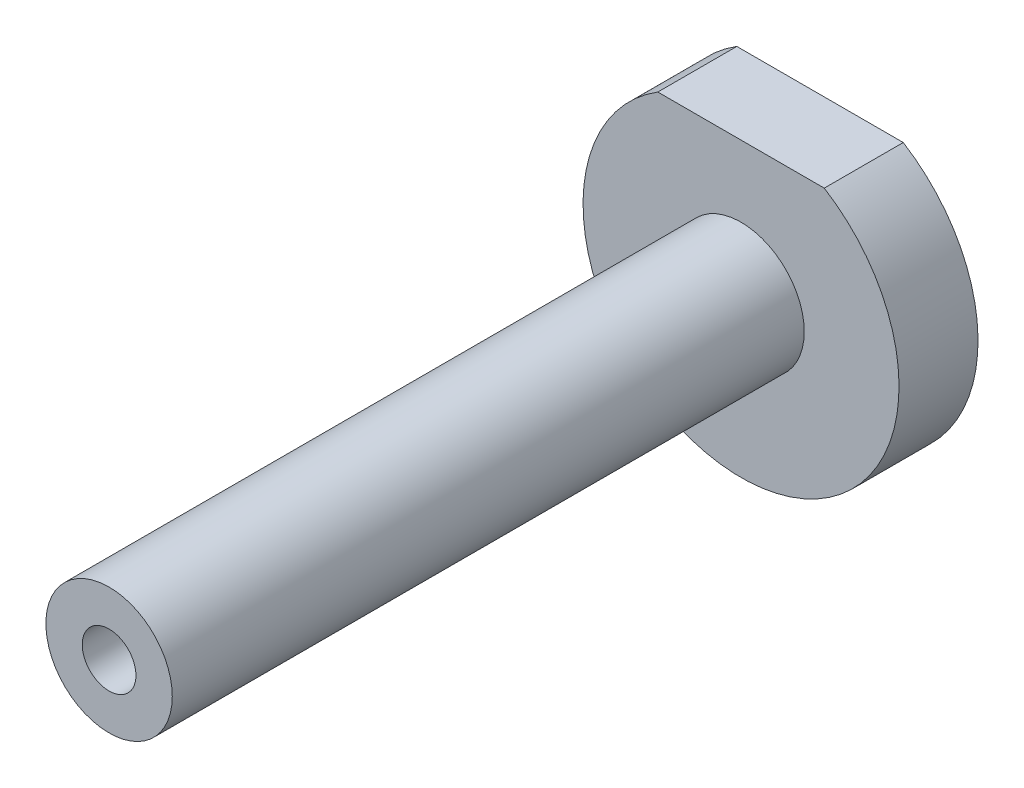
ISO-10303-21;
HEADER;
FILE_DESCRIPTION(('STEP AP214'),'2;1');
FILE_NAME('part.step','',(''),(''),'','','');
FILE_SCHEMA(('AUTOMOTIVE_DESIGN { 1 0 10303 214 1 1 1 1 }'));
ENDSEC;
DATA;
#1=APPLICATION_CONTEXT('core data for automotive mechanical design processes');
#2=APPLICATION_PROTOCOL_DEFINITION('international standard','automotive_design',2000,#1);
#3=PRODUCT_CONTEXT('',#1,'mechanical');
#4=PRODUCT('Part','Part','',(#3));
#5=PRODUCT_RELATED_PRODUCT_CATEGORY('part','',(#4));
#6=PRODUCT_DEFINITION_FORMATION('','',#4);
#7=PRODUCT_DEFINITION_CONTEXT('part definition',#1,'design');
#8=PRODUCT_DEFINITION('design','',#6,#7);
#9=PRODUCT_DEFINITION_SHAPE('','',#8);
#10=(LENGTH_UNIT() NAMED_UNIT(*) SI_UNIT(.MILLI.,.METRE.));
#11=(NAMED_UNIT(*) PLANE_ANGLE_UNIT() SI_UNIT($,.RADIAN.));
#12=(NAMED_UNIT(*) SI_UNIT($,.STERADIAN.) SOLID_ANGLE_UNIT());
#13=UNCERTAINTY_MEASURE_WITH_UNIT(LENGTH_MEASURE(1.E-05),#10,'distance_accuracy_value','');
#14=(GEOMETRIC_REPRESENTATION_CONTEXT(3) GLOBAL_UNCERTAINTY_ASSIGNED_CONTEXT((#13)) GLOBAL_UNIT_ASSIGNED_CONTEXT((#10,
#11,#12)) REPRESENTATION_CONTEXT('',''));
#15=CARTESIAN_POINT('',(0.,0.,0.));
#16=DIRECTION('',(0.,0.,1.));
#17=DIRECTION('',(1.,0.,0.));
#18=AXIS2_PLACEMENT_3D('',#15,#16,#17);
#19=CARTESIAN_POINT('',(0.,0.,10.));
#20=DIRECTION('',(0.,0.,-1.));
#21=DIRECTION('',(-1.,0.,0.));
#22=AXIS2_PLACEMENT_3D('',#19,#20,#21);
#23=CYLINDRICAL_SURFACE('',#22,20.);
#24=DIRECTION('',(0.,0.,-1.));
#25=VECTOR('',#24,1.);
#26=CARTESIAN_POINT('',(10.5356537528527,17.,10.));
#27=LINE('',#26,#25);
#28=CARTESIAN_POINT('',(10.5356537528527,17.,10.));
#29=VERTEX_POINT('',#28);
#30=CARTESIAN_POINT('',(10.5356537528527,17.,0.));
#31=VERTEX_POINT('',#30);
#32=EDGE_CURVE('E59',#29,#31,#27,.T.);
#33=ORIENTED_EDGE('',*,*,#32,.F.);
#34=CARTESIAN_POINT('',(0.,0.,10.));
#35=DIRECTION('',(0.,0.,1.));
#36=DIRECTION('',(1.,0.,0.));
#37=AXIS2_PLACEMENT_3D('',#34,#35,#36);
#38=CIRCLE('',#37,20.);
#39=CARTESIAN_POINT('',(-10.5356537528527,17.,10.));
#40=VERTEX_POINT('',#39);
#41=EDGE_CURVE('E106',#40,#29,#38,.T.);
#42=ORIENTED_EDGE('',*,*,#41,.F.);
#43=DIRECTION('',(0.,0.,-1.));
#44=VECTOR('',#43,1.);
#45=CARTESIAN_POINT('',(-10.5356537528527,17.,10.));
#46=LINE('',#45,#44);
#47=CARTESIAN_POINT('',(-10.5356537528527,17.,0.));
#48=VERTEX_POINT('',#47);
#49=EDGE_CURVE('E64',#48,#40,#46,.F.);
#50=ORIENTED_EDGE('',*,*,#49,.F.);
#51=CARTESIAN_POINT('',(0.,0.,0.));
#52=DIRECTION('',(0.,0.,1.));
#53=DIRECTION('',(1.,0.,0.));
#54=AXIS2_PLACEMENT_3D('',#51,#52,#53);
#55=CIRCLE('',#54,20.);
#56=EDGE_CURVE('E102',#48,#31,#55,.T.);
#57=ORIENTED_EDGE('',*,*,#56,.T.);
#58=EDGE_LOOP('',(#33,#42,#50,#57));
#59=FACE_BOUND('',#58,.T.);
#60=ADVANCED_FACE('F45',(#59),#23,.T.);
#61=CARTESIAN_POINT('',(0.,0.,10.));
#62=DIRECTION('',(0.,0.,1.));
#63=DIRECTION('',(1.,0.,0.));
#64=AXIS2_PLACEMENT_3D('',#61,#62,#63);
#65=PLANE('',#64);
#66=CARTESIAN_POINT('',(0.,0.,10.));
#67=DIRECTION('',(0.,0.,1.));
#68=DIRECTION('',(1.,0.,0.));
#69=AXIS2_PLACEMENT_3D('',#66,#67,#68);
#70=CIRCLE('',#69,8.);
#71=CARTESIAN_POINT('',(8.,0.,10.));
#72=VERTEX_POINT('',#71);
#73=EDGE_CURVE('E53',#72,#72,#70,.T.);
#74=ORIENTED_EDGE('',*,*,#73,.F.);
#75=EDGE_LOOP('',(#74));
#76=FACE_BOUND('',#75,.T.);
#77=ORIENTED_EDGE('',*,*,#41,.T.);
#78=DIRECTION('',(-1.,0.,0.));
#79=VECTOR('',#78,1.);
#80=CARTESIAN_POINT('',(0.,17.,10.));
#81=LINE('',#80,#79);
#82=EDGE_CURVE('E84',#29,#40,#81,.T.);
#83=ORIENTED_EDGE('',*,*,#82,.T.);
#84=EDGE_LOOP('',(#77,#83));
#85=FACE_BOUND('',#84,.T.);
#86=ADVANCED_FACE('F127',(#76,#85),#65,.T.);
#87=CARTESIAN_POINT('',(0.,0.,0.));
#88=DIRECTION('',(0.,0.,1.));
#89=DIRECTION('',(1.,0.,0.));
#90=AXIS2_PLACEMENT_3D('',#87,#88,#89);
#91=PLANE('',#90);
#92=DIRECTION('',(-1.,0.,0.));
#93=VECTOR('',#92,1.);
#94=CARTESIAN_POINT('',(0.,17.,0.));
#95=LINE('',#94,#93);
#96=EDGE_CURVE('E11',#31,#48,#95,.T.);
#97=ORIENTED_EDGE('',*,*,#96,.F.);
#98=ORIENTED_EDGE('',*,*,#56,.F.);
#99=EDGE_LOOP('',(#97,#98));
#100=FACE_BOUND('',#99,.T.);
#101=ADVANCED_FACE('F116',(#100),#91,.F.);
#102=CARTESIAN_POINT('',(0.,0.,90.));
#103=DIRECTION('',(0.,0.,-1.));
#104=DIRECTION('',(-1.,0.,0.));
#105=AXIS2_PLACEMENT_3D('',#102,#103,#104);
#106=CYLINDRICAL_SURFACE('',#105,8.);
#107=CARTESIAN_POINT('',(0.,0.,90.));
#108=DIRECTION('',(0.,0.,1.));
#109=DIRECTION('',(1.,0.,0.));
#110=AXIS2_PLACEMENT_3D('',#107,#108,#109);
#111=CIRCLE('',#110,8.);
#112=CARTESIAN_POINT('',(8.,0.,90.));
#113=VERTEX_POINT('',#112);
#114=EDGE_CURVE('E98',#113,#113,#111,.T.);
#115=ORIENTED_EDGE('',*,*,#114,.F.);
#116=EDGE_LOOP('',(#115));
#117=FACE_BOUND('',#116,.T.);
#118=ORIENTED_EDGE('',*,*,#73,.T.);
#119=EDGE_LOOP('',(#118));
#120=FACE_BOUND('',#119,.T.);
#121=ADVANCED_FACE('F123',(#117,#120),#106,.T.);
#122=CARTESIAN_POINT('',(0.,0.,90.));
#123=DIRECTION('',(0.,0.,1.));
#124=DIRECTION('',(1.,0.,0.));
#125=AXIS2_PLACEMENT_3D('',#122,#123,#124);
#126=PLANE('',#125);
#127=CARTESIAN_POINT('',(0.,0.,90.));
#128=DIRECTION('',(0.,0.,1.));
#129=DIRECTION('',(1.,0.,0.));
#130=AXIS2_PLACEMENT_3D('',#127,#128,#129);
#131=CIRCLE('',#130,3.4);
#132=CARTESIAN_POINT('',(3.4,0.,90.));
#133=VERTEX_POINT('',#132);
#134=EDGE_CURVE('E85',#133,#133,#131,.T.);
#135=ORIENTED_EDGE('',*,*,#134,.F.);
#136=EDGE_LOOP('',(#135));
#137=FACE_BOUND('',#136,.T.);
#138=ORIENTED_EDGE('',*,*,#114,.T.);
#139=EDGE_LOOP('',(#138));
#140=FACE_BOUND('',#139,.T.);
#141=ADVANCED_FACE('F118',(#137,#140),#126,.T.);
#142=CARTESIAN_POINT('',(-18.1730871722982,17.,41.));
#143=DIRECTION('',(0.,1.,0.));
#144=DIRECTION('',(0.,0.,1.));
#145=AXIS2_PLACEMENT_3D('',#142,#143,#144);
#146=PLANE('',#145);
#147=ORIENTED_EDGE('',*,*,#32,.T.);
#148=ORIENTED_EDGE('',*,*,#96,.T.);
#149=ORIENTED_EDGE('',*,*,#49,.T.);
#150=ORIENTED_EDGE('',*,*,#82,.F.);
#151=EDGE_LOOP('',(#147,#148,#149,#150));
#152=FACE_BOUND('',#151,.T.);
#153=ADVANCED_FACE('F77',(#152),#146,.T.);
#154=CARTESIAN_POINT('',(0.,0.,67.75));
#155=DIRECTION('',(0.,0.,1.));
#156=DIRECTION('',(1.,0.,0.));
#157=AXIS2_PLACEMENT_3D('',#154,#155,#156);
#158=CONICAL_SURFACE('',#157,3.4,1.02974425867665);
#159=CARTESIAN_POINT('',(0.,0.,65.7070738953063));
#160=VERTEX_POINT('',#159);
#161=VERTEX_LOOP('',#160);
#162=FACE_BOUND('',#161,.T.);
#163=CARTESIAN_POINT('',(0.,0.,67.75));
#164=DIRECTION('',(0.,0.,1.));
#165=DIRECTION('',(1.,0.,0.));
#166=AXIS2_PLACEMENT_3D('',#163,#164,#165);
#167=CIRCLE('',#166,3.4);
#168=CARTESIAN_POINT('',(3.4,0.,67.75));
#169=VERTEX_POINT('',#168);
#170=EDGE_CURVE('E81',#169,#169,#167,.T.);
#171=ORIENTED_EDGE('',*,*,#170,.T.);
#172=EDGE_LOOP('',(#171));
#173=FACE_BOUND('',#172,.T.);
#174=ADVANCED_FACE('F73',(#162,#173),#158,.F.);
#175=CARTESIAN_POINT('',(0.,0.,90.));
#176=DIRECTION('',(0.,0.,1.));
#177=DIRECTION('',(1.,0.,0.));
#178=AXIS2_PLACEMENT_3D('',#175,#176,#177);
#179=CYLINDRICAL_SURFACE('',#178,3.4);
#180=ORIENTED_EDGE('',*,*,#170,.F.);
#181=EDGE_LOOP('',(#180));
#182=FACE_BOUND('',#181,.T.);
#183=ORIENTED_EDGE('',*,*,#134,.T.);
#184=EDGE_LOOP('',(#183));
#185=FACE_BOUND('',#184,.T.);
#186=ADVANCED_FACE('F76',(#182,#185),#179,.F.);
#187=CLOSED_SHELL('',(#60,#86,#101,#121,#141,#153,#174,#186));
#188=MANIFOLD_SOLID_BREP('B2',#187);
#189=ADVANCED_BREP_SHAPE_REPRESENTATION('',(#18,#188),#14);
#190=SHAPE_DEFINITION_REPRESENTATION(#9,#189);
ENDSEC;
END-ISO-10303-21;
